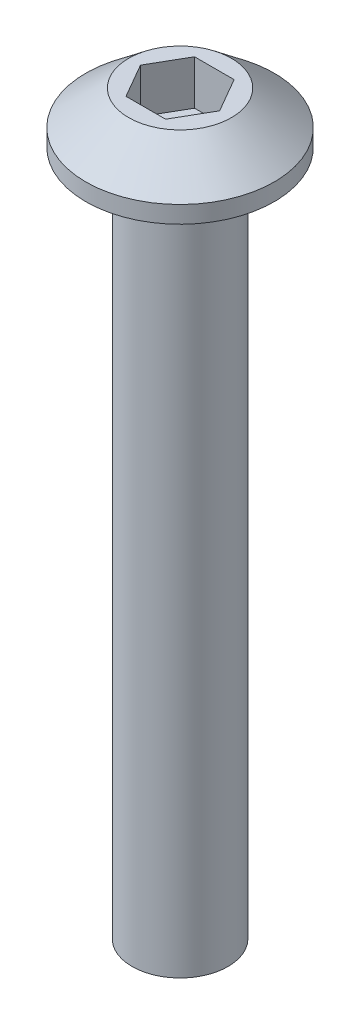
ISO-10303-21;
HEADER;
FILE_DESCRIPTION(('STEP AP214'),'2;1');
FILE_NAME('part.step','',(''),(''),'','','');
FILE_SCHEMA(('AUTOMOTIVE_DESIGN { 1 0 10303 214 1 1 1 1 }'));
ENDSEC;
DATA;
#1=APPLICATION_CONTEXT('core data for automotive mechanical design processes');
#2=APPLICATION_PROTOCOL_DEFINITION('international standard','automotive_design',2000,#1);
#3=PRODUCT_CONTEXT('',#1,'mechanical');
#4=PRODUCT('Part','Part','',(#3));
#5=PRODUCT_RELATED_PRODUCT_CATEGORY('part','',(#4));
#6=PRODUCT_DEFINITION_FORMATION('','',#4);
#7=PRODUCT_DEFINITION_CONTEXT('part definition',#1,'design');
#8=PRODUCT_DEFINITION('design','',#6,#7);
#9=PRODUCT_DEFINITION_SHAPE('','',#8);
#10=(LENGTH_UNIT() NAMED_UNIT(*) SI_UNIT(.MILLI.,.METRE.));
#11=(NAMED_UNIT(*) PLANE_ANGLE_UNIT() SI_UNIT($,.RADIAN.));
#12=(NAMED_UNIT(*) SI_UNIT($,.STERADIAN.) SOLID_ANGLE_UNIT());
#13=UNCERTAINTY_MEASURE_WITH_UNIT(LENGTH_MEASURE(1.E-05),#10,'distance_accuracy_value','');
#14=(GEOMETRIC_REPRESENTATION_CONTEXT(3) GLOBAL_UNCERTAINTY_ASSIGNED_CONTEXT((#13)) GLOBAL_UNIT_ASSIGNED_CONTEXT((#10,
#11,#12)) REPRESENTATION_CONTEXT('',''));
#15=CARTESIAN_POINT('',(0.,0.,0.));
#16=DIRECTION('',(0.,0.,1.));
#17=DIRECTION('',(1.,0.,0.));
#18=AXIS2_PLACEMENT_3D('',#15,#16,#17);
#19=CARTESIAN_POINT('',(0.,21.5,0.));
#20=DIRECTION('',(0.,-1.,0.));
#21=DIRECTION('',(0.,0.,-1.));
#22=AXIS2_PLACEMENT_3D('',#19,#20,#21);
#23=CYLINDRICAL_SURFACE('',#22,2.75);
#24=CARTESIAN_POINT('',(0.,20.,0.));
#25=DIRECTION('',(0.,1.,0.));
#26=DIRECTION('',(0.,0.,1.));
#27=AXIS2_PLACEMENT_3D('',#24,#25,#26);
#28=CIRCLE('',#27,2.75);
#29=CARTESIAN_POINT('',(0.,20.,2.75));
#30=VERTEX_POINT('',#29);
#31=EDGE_CURVE('E177',#30,#30,#28,.T.);
#32=ORIENTED_EDGE('',*,*,#31,.T.);
#33=EDGE_LOOP('',(#32));
#34=FACE_BOUND('',#33,.T.);
#35=CARTESIAN_POINT('',(0.,20.5,0.));
#36=DIRECTION('',(0.,1.,0.));
#37=DIRECTION('',(0.,0.,1.));
#38=AXIS2_PLACEMENT_3D('',#35,#36,#37);
#39=CIRCLE('',#38,2.75);
#40=CARTESIAN_POINT('',(0.,20.5,2.75));
#41=VERTEX_POINT('',#40);
#42=EDGE_CURVE('E173',#41,#41,#39,.T.);
#43=ORIENTED_EDGE('',*,*,#42,.F.);
#44=EDGE_LOOP('',(#43));
#45=FACE_BOUND('',#44,.T.);
#46=ADVANCED_FACE('F45',(#34,#45),#23,.T.);
#47=CARTESIAN_POINT('',(0.,20.,0.));
#48=DIRECTION('',(0.,-1.,0.));
#49=DIRECTION('',(0.,0.,-1.));
#50=AXIS2_PLACEMENT_3D('',#47,#48,#49);
#51=CYLINDRICAL_SURFACE('',#50,1.4);
#52=CARTESIAN_POINT('',(0.,20.,0.));
#53=DIRECTION('',(0.,1.,0.));
#54=DIRECTION('',(0.,0.,1.));
#55=AXIS2_PLACEMENT_3D('',#52,#53,#54);
#56=CIRCLE('',#55,1.4);
#57=CARTESIAN_POINT('',(0.,20.,1.4));
#58=VERTEX_POINT('',#57);
#59=EDGE_CURVE('E11',#58,#58,#56,.T.);
#60=ORIENTED_EDGE('',*,*,#59,.F.);
#61=EDGE_LOOP('',(#60));
#62=FACE_BOUND('',#61,.T.);
#63=CARTESIAN_POINT('',(0.,0.,0.));
#64=DIRECTION('',(0.,1.,0.));
#65=DIRECTION('',(0.,0.,1.));
#66=AXIS2_PLACEMENT_3D('',#63,#64,#65);
#67=CIRCLE('',#66,1.4);
#68=CARTESIAN_POINT('',(0.,0.,1.4));
#69=VERTEX_POINT('',#68);
#70=EDGE_CURVE('E49',#69,#69,#67,.T.);
#71=ORIENTED_EDGE('',*,*,#70,.T.);
#72=EDGE_LOOP('',(#71));
#73=FACE_BOUND('',#72,.T.);
#74=ADVANCED_FACE('F47',(#62,#73),#51,.T.);
#75=CARTESIAN_POINT('',(0.,0.,0.));
#76=DIRECTION('',(0.,1.,0.));
#77=DIRECTION('',(0.,0.,1.));
#78=AXIS2_PLACEMENT_3D('',#75,#76,#77);
#79=PLANE('',#78);
#80=ORIENTED_EDGE('',*,*,#70,.F.);
#81=EDGE_LOOP('',(#80));
#82=FACE_BOUND('',#81,.T.);
#83=ADVANCED_FACE('F187',(#82),#79,.F.);
#84=CARTESIAN_POINT('',(0.,20.,0.));
#85=DIRECTION('',(0.,1.,0.));
#86=DIRECTION('',(0.,0.,1.));
#87=AXIS2_PLACEMENT_3D('',#84,#85,#86);
#88=PLANE('',#87);
#89=ORIENTED_EDGE('',*,*,#59,.T.);
#90=EDGE_LOOP('',(#89));
#91=FACE_BOUND('',#90,.T.);
#92=ORIENTED_EDGE('',*,*,#31,.F.);
#93=EDGE_LOOP('',(#92));
#94=FACE_BOUND('',#93,.T.);
#95=ADVANCED_FACE('F189',(#91,#94),#88,.F.);
#96=CARTESIAN_POINT('',(0.,21.5,0.));
#97=DIRECTION('',(0.,-1.,0.));
#98=DIRECTION('',(0.,0.,-1.));
#99=AXIS2_PLACEMENT_3D('',#96,#97,#98);
#100=CONICAL_SURFACE('',#99,1.5,0.896055384571343);
#101=ORIENTED_EDGE('',*,*,#42,.T.);
#102=EDGE_LOOP('',(#101));
#103=FACE_BOUND('',#102,.T.);
#104=CARTESIAN_POINT('',(0.,21.5,0.));
#105=DIRECTION('',(0.,1.,0.));
#106=DIRECTION('',(0.,0.,1.));
#107=AXIS2_PLACEMENT_3D('',#104,#105,#106);
#108=CIRCLE('',#107,1.5);
#109=CARTESIAN_POINT('',(0.,21.5,1.5));
#110=VERTEX_POINT('',#109);
#111=EDGE_CURVE('E160',#110,#110,#108,.T.);
#112=ORIENTED_EDGE('',*,*,#111,.F.);
#113=EDGE_LOOP('',(#112));
#114=FACE_BOUND('',#113,.T.);
#115=ADVANCED_FACE('F194',(#103,#114),#100,.T.);
#116=CARTESIAN_POINT('',(0.,21.5,0.));
#117=DIRECTION('',(0.,1.,0.));
#118=DIRECTION('',(0.,0.,1.));
#119=AXIS2_PLACEMENT_3D('',#116,#117,#118);
#120=PLANE('',#119);
#121=DIRECTION('',(0.5,0.,-0.866025403784439));
#122=VECTOR('',#121,1.);
#123=CARTESIAN_POINT('',(0.577350269189626,21.5,1.));
#124=LINE('',#123,#122);
#125=CARTESIAN_POINT('',(0.577350269189626,21.5,1.));
#126=VERTEX_POINT('',#125);
#127=CARTESIAN_POINT('',(1.15470053837925,21.5,0.));
#128=VERTEX_POINT('',#127);
#129=EDGE_CURVE('E61',#126,#128,#124,.T.);
#130=ORIENTED_EDGE('',*,*,#129,.F.);
#131=DIRECTION('',(1.,0.,0.));
#132=VECTOR('',#131,1.);
#133=CARTESIAN_POINT('',(-0.577350269189626,21.5,1.));
#134=LINE('',#133,#132);
#135=CARTESIAN_POINT('',(-0.577350269189626,21.5,1.));
#136=VERTEX_POINT('',#135);
#137=EDGE_CURVE('E154',#136,#126,#134,.T.);
#138=ORIENTED_EDGE('',*,*,#137,.F.);
#139=DIRECTION('',(0.5,0.,0.866025403784438));
#140=VECTOR('',#139,1.);
#141=CARTESIAN_POINT('',(-1.15470053837925,21.5,0.));
#142=LINE('',#141,#140);
#143=CARTESIAN_POINT('',(-1.15470053837925,21.5,0.));
#144=VERTEX_POINT('',#143);
#145=EDGE_CURVE('E151',#144,#136,#142,.T.);
#146=ORIENTED_EDGE('',*,*,#145,.F.);
#147=DIRECTION('',(-0.5,0.,0.866025403784439));
#148=VECTOR('',#147,1.);
#149=CARTESIAN_POINT('',(-0.577350269189626,21.5,-1.));
#150=LINE('',#149,#148);
#151=CARTESIAN_POINT('',(-0.577350269189626,21.5,-1.));
#152=VERTEX_POINT('',#151);
#153=EDGE_CURVE('E109',#152,#144,#150,.T.);
#154=ORIENTED_EDGE('',*,*,#153,.F.);
#155=DIRECTION('',(-1.,0.,0.));
#156=VECTOR('',#155,1.);
#157=CARTESIAN_POINT('',(0.577350269189625,21.5,-1.));
#158=LINE('',#157,#156);
#159=CARTESIAN_POINT('',(0.577350269189625,21.5,-1.));
#160=VERTEX_POINT('',#159);
#161=EDGE_CURVE('E145',#160,#152,#158,.T.);
#162=ORIENTED_EDGE('',*,*,#161,.F.);
#163=DIRECTION('',(-0.5,0.,-0.866025403784439));
#164=VECTOR('',#163,1.);
#165=CARTESIAN_POINT('',(1.15470053837925,21.5,0.));
#166=LINE('',#165,#164);
#167=EDGE_CURVE('E141',#128,#160,#166,.T.);
#168=ORIENTED_EDGE('',*,*,#167,.F.);
#169=EDGE_LOOP('',(#130,#138,#146,#154,#162,#168));
#170=FACE_BOUND('',#169,.T.);
#171=ORIENTED_EDGE('',*,*,#111,.T.);
#172=EDGE_LOOP('',(#171));
#173=FACE_BOUND('',#172,.T.);
#174=ADVANCED_FACE('F204',(#170,#173),#120,.T.);
#175=CARTESIAN_POINT('',(0.577350269189626,20.2,1.));
#176=DIRECTION('',(0.866025403784439,0.,0.5));
#177=DIRECTION('',(0.5,0.,-0.866025403784439));
#178=AXIS2_PLACEMENT_3D('',#175,#176,#177);
#179=PLANE('',#178);
#180=ORIENTED_EDGE('',*,*,#129,.T.);
#181=DIRECTION('',(0.,1.,0.));
#182=VECTOR('',#181,1.);
#183=CARTESIAN_POINT('',(1.15470053837925,20.2,0.));
#184=LINE('',#183,#182);
#185=CARTESIAN_POINT('',(1.15470053837925,20.2,0.));
#186=VERTEX_POINT('',#185);
#187=EDGE_CURVE('E91',#186,#128,#184,.T.);
#188=ORIENTED_EDGE('',*,*,#187,.F.);
#189=DIRECTION('',(0.5,0.,-0.866025403784439));
#190=VECTOR('',#189,1.);
#191=CARTESIAN_POINT('',(0.577350269189626,20.2,1.));
#192=LINE('',#191,#190);
#193=CARTESIAN_POINT('',(0.577350269189626,20.2,1.));
#194=VERTEX_POINT('',#193);
#195=EDGE_CURVE('E157',#194,#186,#192,.T.);
#196=ORIENTED_EDGE('',*,*,#195,.F.);
#197=DIRECTION('',(0.,1.,0.));
#198=VECTOR('',#197,1.);
#199=CARTESIAN_POINT('',(0.577350269189626,20.2,1.));
#200=LINE('',#199,#198);
#201=EDGE_CURVE('E69',#194,#126,#200,.T.);
#202=ORIENTED_EDGE('',*,*,#201,.T.);
#203=EDGE_LOOP('',(#180,#188,#196,#202));
#204=FACE_BOUND('',#203,.T.);
#205=ADVANCED_FACE('F207',(#204),#179,.F.);
#206=CARTESIAN_POINT('',(-0.577350269189626,20.2,1.));
#207=DIRECTION('',(0.,0.,1.));
#208=DIRECTION('',(1.,0.,0.));
#209=AXIS2_PLACEMENT_3D('',#206,#207,#208);
#210=PLANE('',#209);
#211=ORIENTED_EDGE('',*,*,#137,.T.);
#212=ORIENTED_EDGE('',*,*,#201,.F.);
#213=DIRECTION('',(1.,0.,0.));
#214=VECTOR('',#213,1.);
#215=CARTESIAN_POINT('',(-0.577350269189626,20.2,1.));
#216=LINE('',#215,#214);
#217=CARTESIAN_POINT('',(-0.577350269189626,20.2,1.));
#218=VERTEX_POINT('',#217);
#219=EDGE_CURVE('E123',#218,#194,#216,.T.);
#220=ORIENTED_EDGE('',*,*,#219,.F.);
#221=DIRECTION('',(0.,1.,0.));
#222=VECTOR('',#221,1.);
#223=CARTESIAN_POINT('',(-0.577350269189626,20.2,1.));
#224=LINE('',#223,#222);
#225=EDGE_CURVE('E114',#218,#136,#224,.T.);
#226=ORIENTED_EDGE('',*,*,#225,.T.);
#227=EDGE_LOOP('',(#211,#212,#220,#226));
#228=FACE_BOUND('',#227,.T.);
#229=ADVANCED_FACE('F214',(#228),#210,.F.);
#230=CARTESIAN_POINT('',(-1.15470053837925,20.2,0.));
#231=DIRECTION('',(-0.866025403784439,0.,0.5));
#232=DIRECTION('',(0.5,0.,0.866025403784439));
#233=AXIS2_PLACEMENT_3D('',#230,#231,#232);
#234=PLANE('',#233);
#235=ORIENTED_EDGE('',*,*,#145,.T.);
#236=ORIENTED_EDGE('',*,*,#225,.F.);
#237=DIRECTION('',(0.5,0.,0.866025403784438));
#238=VECTOR('',#237,1.);
#239=CARTESIAN_POINT('',(-1.15470053837925,20.2,0.));
#240=LINE('',#239,#238);
#241=CARTESIAN_POINT('',(-1.15470053837925,20.2,0.));
#242=VERTEX_POINT('',#241);
#243=EDGE_CURVE('E118',#242,#218,#240,.T.);
#244=ORIENTED_EDGE('',*,*,#243,.F.);
#245=DIRECTION('',(0.,1.,0.));
#246=VECTOR('',#245,1.);
#247=CARTESIAN_POINT('',(-1.15470053837925,20.2,0.));
#248=LINE('',#247,#246);
#249=EDGE_CURVE('E102',#242,#144,#248,.T.);
#250=ORIENTED_EDGE('',*,*,#249,.T.);
#251=EDGE_LOOP('',(#235,#236,#244,#250));
#252=FACE_BOUND('',#251,.T.);
#253=ADVANCED_FACE('F119',(#252),#234,.F.);
#254=CARTESIAN_POINT('',(-0.577350269189626,20.2,-1.));
#255=DIRECTION('',(-0.866025403784439,0.,-0.5));
#256=DIRECTION('',(-0.5,0.,0.866025403784439));
#257=AXIS2_PLACEMENT_3D('',#254,#255,#256);
#258=PLANE('',#257);
#259=ORIENTED_EDGE('',*,*,#153,.T.);
#260=ORIENTED_EDGE('',*,*,#249,.F.);
#261=DIRECTION('',(-0.5,0.,0.866025403784439));
#262=VECTOR('',#261,1.);
#263=CARTESIAN_POINT('',(-0.577350269189626,20.2,-1.));
#264=LINE('',#263,#262);
#265=CARTESIAN_POINT('',(-0.577350269189626,20.2,-1.));
#266=VERTEX_POINT('',#265);
#267=EDGE_CURVE('E106',#266,#242,#264,.T.);
#268=ORIENTED_EDGE('',*,*,#267,.F.);
#269=DIRECTION('',(0.,1.,0.));
#270=VECTOR('',#269,1.);
#271=CARTESIAN_POINT('',(-0.577350269189626,20.2,-1.));
#272=LINE('',#271,#270);
#273=EDGE_CURVE('E115',#266,#152,#272,.T.);
#274=ORIENTED_EDGE('',*,*,#273,.T.);
#275=EDGE_LOOP('',(#259,#260,#268,#274));
#276=FACE_BOUND('',#275,.T.);
#277=ADVANCED_FACE('F104',(#276),#258,.F.);
#278=CARTESIAN_POINT('',(0.577350269189625,20.2,-1.));
#279=DIRECTION('',(0.,0.,-1.));
#280=DIRECTION('',(-1.,0.,0.));
#281=AXIS2_PLACEMENT_3D('',#278,#279,#280);
#282=PLANE('',#281);
#283=ORIENTED_EDGE('',*,*,#161,.T.);
#284=ORIENTED_EDGE('',*,*,#273,.F.);
#285=DIRECTION('',(-1.,0.,0.));
#286=VECTOR('',#285,1.);
#287=CARTESIAN_POINT('',(0.577350269189625,20.2,-1.));
#288=LINE('',#287,#286);
#289=CARTESIAN_POINT('',(0.577350269189625,20.2,-1.));
#290=VERTEX_POINT('',#289);
#291=EDGE_CURVE('E129',#290,#266,#288,.T.);
#292=ORIENTED_EDGE('',*,*,#291,.F.);
#293=DIRECTION('',(0.,1.,0.));
#294=VECTOR('',#293,1.);
#295=CARTESIAN_POINT('',(0.577350269189625,20.2,-1.));
#296=LINE('',#295,#294);
#297=EDGE_CURVE('E165',#290,#160,#296,.T.);
#298=ORIENTED_EDGE('',*,*,#297,.T.);
#299=EDGE_LOOP('',(#283,#284,#292,#298));
#300=FACE_BOUND('',#299,.T.);
#301=ADVANCED_FACE('F218',(#300),#282,.F.);
#302=CARTESIAN_POINT('',(1.15470053837925,20.2,0.));
#303=DIRECTION('',(0.866025403784439,0.,-0.5));
#304=DIRECTION('',(-0.5,0.,-0.866025403784439));
#305=AXIS2_PLACEMENT_3D('',#302,#303,#304);
#306=PLANE('',#305);
#307=ORIENTED_EDGE('',*,*,#167,.T.);
#308=ORIENTED_EDGE('',*,*,#297,.F.);
#309=DIRECTION('',(-0.5,0.,-0.866025403784439));
#310=VECTOR('',#309,1.);
#311=CARTESIAN_POINT('',(1.15470053837925,20.2,0.));
#312=LINE('',#311,#310);
#313=EDGE_CURVE('E133',#186,#290,#312,.T.);
#314=ORIENTED_EDGE('',*,*,#313,.F.);
#315=ORIENTED_EDGE('',*,*,#187,.T.);
#316=EDGE_LOOP('',(#307,#308,#314,#315));
#317=FACE_BOUND('',#316,.T.);
#318=ADVANCED_FACE('F215',(#317),#306,.F.);
#319=CARTESIAN_POINT('',(0.,20.2,0.));
#320=DIRECTION('',(0.,1.,0.));
#321=DIRECTION('',(0.,0.,1.));
#322=AXIS2_PLACEMENT_3D('',#319,#320,#321);
#323=PLANE('',#322);
#324=ORIENTED_EDGE('',*,*,#195,.T.);
#325=ORIENTED_EDGE('',*,*,#313,.T.);
#326=ORIENTED_EDGE('',*,*,#291,.T.);
#327=ORIENTED_EDGE('',*,*,#267,.T.);
#328=ORIENTED_EDGE('',*,*,#243,.T.);
#329=ORIENTED_EDGE('',*,*,#219,.T.);
#330=EDGE_LOOP('',(#324,#325,#326,#327,#328,#329));
#331=FACE_BOUND('',#330,.T.);
#332=ADVANCED_FACE('F126',(#331),#323,.T.);
#333=CLOSED_SHELL('',(#46,#74,#83,#95,#115,#174,#205,#229,#253,#277,#301,#318,#332));
#334=MANIFOLD_SOLID_BREP('B2',#333);
#335=ADVANCED_BREP_SHAPE_REPRESENTATION('',(#18,#334),#14);
#336=SHAPE_DEFINITION_REPRESENTATION(#9,#335);
ENDSEC;
END-ISO-10303-21;
